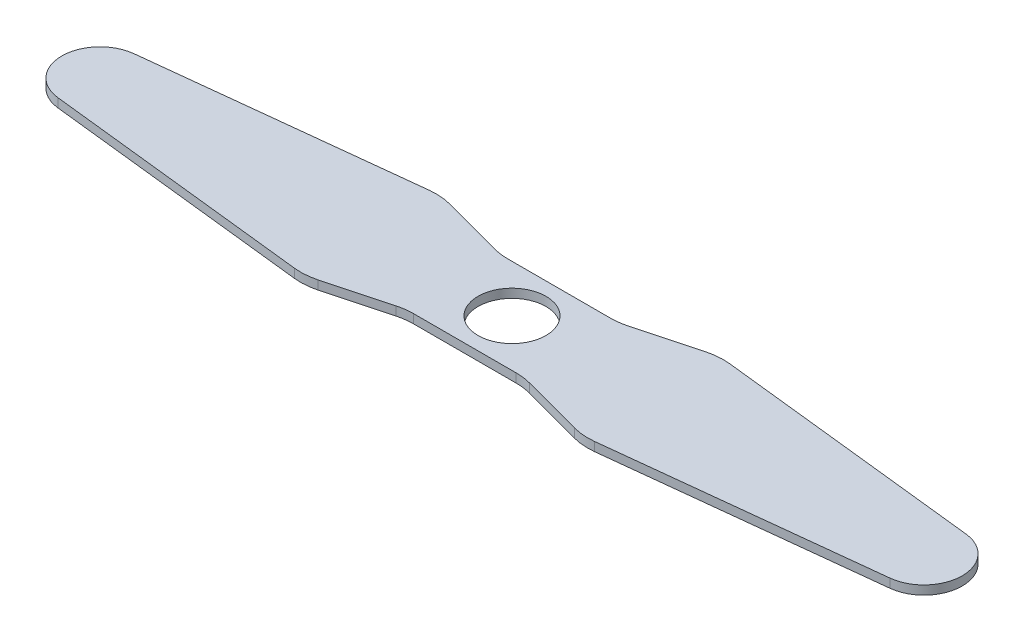
ISO-10303-21;
HEADER;
FILE_DESCRIPTION(('STEP AP214'),'2;1');
FILE_NAME('part.step','',(''),(''),'','','');
FILE_SCHEMA(('AUTOMOTIVE_DESIGN { 1 0 10303 214 1 1 1 1 }'));
ENDSEC;
DATA;
#1=APPLICATION_CONTEXT('core data for automotive mechanical design processes');
#2=APPLICATION_PROTOCOL_DEFINITION('international standard','automotive_design',2000,#1);
#3=PRODUCT_CONTEXT('',#1,'mechanical');
#4=PRODUCT('Part','Part','',(#3));
#5=PRODUCT_RELATED_PRODUCT_CATEGORY('part','',(#4));
#6=PRODUCT_DEFINITION_FORMATION('','',#4);
#7=PRODUCT_DEFINITION_CONTEXT('part definition',#1,'design');
#8=PRODUCT_DEFINITION('design','',#6,#7);
#9=PRODUCT_DEFINITION_SHAPE('','',#8);
#10=(LENGTH_UNIT() NAMED_UNIT(*) SI_UNIT(.MILLI.,.METRE.));
#11=(NAMED_UNIT(*) PLANE_ANGLE_UNIT() SI_UNIT($,.RADIAN.));
#12=(NAMED_UNIT(*) SI_UNIT($,.STERADIAN.) SOLID_ANGLE_UNIT());
#13=UNCERTAINTY_MEASURE_WITH_UNIT(LENGTH_MEASURE(1.E-05),#10,'distance_accuracy_value','');
#14=(GEOMETRIC_REPRESENTATION_CONTEXT(3) GLOBAL_UNCERTAINTY_ASSIGNED_CONTEXT((#13)) GLOBAL_UNIT_ASSIGNED_CONTEXT((#10,
#11,#12)) REPRESENTATION_CONTEXT('',''));
#15=CARTESIAN_POINT('',(0.,0.,0.));
#16=DIRECTION('',(0.,0.,1.));
#17=DIRECTION('',(1.,0.,0.));
#18=AXIS2_PLACEMENT_3D('',#15,#16,#17);
#19=CARTESIAN_POINT('',(0.,0.9525,-15.875));
#20=DIRECTION('',(0.,1.,0.));
#21=DIRECTION('',(0.,0.,1.));
#22=AXIS2_PLACEMENT_3D('',#19,#20,#21);
#23=PLANE('',#22);
#24=DIRECTION('',(1.,0.,0.));
#25=VECTOR('',#24,1.);
#26=CARTESIAN_POINT('',(0.,0.9525,-10.16));
#27=LINE('',#26,#25);
#28=CARTESIAN_POINT('',(-0.868013280640019,0.9525,-10.16));
#29=VERTEX_POINT('',#28);
#30=CARTESIAN_POINT('',(21.18801328064,0.9525,-10.16));
#31=VERTEX_POINT('',#30);
#32=EDGE_CURVE('E361',#29,#31,#27,.T.);
#33=ORIENTED_EDGE('',*,*,#32,.F.);
#34=CARTESIAN_POINT('',(-0.868013280640064,0.9525,-22.86));
#35=DIRECTION('',(0.,-1.,0.));
#36=DIRECTION('',(0.,0.,1.));
#37=AXIS2_PLACEMENT_3D('',#34,#35,#36);
#38=CIRCLE('',#37,12.7);
#39=CARTESIAN_POINT('',(-4.15501515344213,0.9525,-10.5927420061289));
#40=VERTEX_POINT('',#39);
#41=EDGE_CURVE('E252',#40,#29,#38,.F.);
#42=ORIENTED_EDGE('',*,*,#41,.F.);
#43=DIRECTION('',(-0.965925826289068,0.,-0.258819045102522));
#44=VECTOR('',#43,1.);
#45=CARTESIAN_POINT('',(21.3286703652561,0.9525,-3.76440905122493));
#46=LINE('',#45,#44);
#47=CARTESIAN_POINT('',(-17.4067971096181,0.9525,-14.1435462795596));
#48=VERTEX_POINT('',#47);
#49=EDGE_CURVE('E256',#40,#48,#46,.T.);
#50=ORIENTED_EDGE('',*,*,#49,.T.);
#51=CARTESIAN_POINT('',(-20.6937989824202,0.9525,-1.8762882856884));
#52=DIRECTION('',(0.,-1.,0.));
#53=DIRECTION('',(0.,0.,1.));
#54=AXIS2_PLACEMENT_3D('',#51,#52,#53);
#55=CIRCLE('',#54,12.7);
#56=CARTESIAN_POINT('',(-22.0884726731469,0.9525,-14.4994766823018));
#57=VERTEX_POINT('',#56);
#58=EDGE_CURVE('E235',#57,#48,#55,.T.);
#59=ORIENTED_EDGE('',*,*,#58,.F.);
#60=DIRECTION('',(-0.993951842253023,0.,0.109816826041469));
#61=VECTOR('',#60,1.);
#62=CARTESIAN_POINT('',(18.2259089373247,0.9525,-18.9536134363031));
#63=LINE('',#62,#61);
#64=CARTESIAN_POINT('',(-79.2882070496085,0.9525,-8.17976076387293));
#65=VERTEX_POINT('',#64);
#66=EDGE_CURVE('E247',#57,#65,#63,.T.);
#67=ORIENTED_EDGE('',*,*,#66,.T.);
#68=CARTESIAN_POINT('',(-78.3844657145847,0.9525,0.));
#69=DIRECTION('',(0.,-1.,0.));
#70=DIRECTION('',(0.,0.,1.));
#71=AXIS2_PLACEMENT_3D('',#68,#69,#70);
#72=CIRCLE('',#71,8.22953428541527);
#73=CARTESIAN_POINT('',(-79.2882070496085,0.9525,8.17976076387291));
#74=VERTEX_POINT('',#73);
#75=EDGE_CURVE('E251',#65,#74,#72,.F.);
#76=ORIENTED_EDGE('',*,*,#75,.T.);
#77=DIRECTION('',(-0.993951842253023,0.,-0.109816826041469));
#78=VECTOR('',#77,1.);
#79=CARTESIAN_POINT('',(18.2259089373247,0.9525,18.9536134363031));
#80=LINE('',#79,#78);
#81=CARTESIAN_POINT('',(-22.0884726731469,0.9525,14.4994766823018));
#82=VERTEX_POINT('',#81);
#83=EDGE_CURVE('E220',#82,#74,#80,.T.);
#84=ORIENTED_EDGE('',*,*,#83,.F.);
#85=CARTESIAN_POINT('',(-20.6937989824202,0.9525,1.87628828568839));
#86=DIRECTION('',(0.,-1.,0.));
#87=DIRECTION('',(0.,0.,1.));
#88=AXIS2_PLACEMENT_3D('',#85,#86,#87);
#89=CIRCLE('',#88,12.7);
#90=CARTESIAN_POINT('',(-17.4067971096181,0.9525,14.1435462795595));
#91=VERTEX_POINT('',#90);
#92=EDGE_CURVE('E224',#91,#82,#89,.T.);
#93=ORIENTED_EDGE('',*,*,#92,.F.);
#94=DIRECTION('',(-0.965925826289068,0.,0.258819045102521));
#95=VECTOR('',#94,1.);
#96=CARTESIAN_POINT('',(21.3286703652561,0.9525,3.76440905122493));
#97=LINE('',#96,#95);
#98=CARTESIAN_POINT('',(-4.15501515344214,0.9525,10.5927420061288));
#99=VERTEX_POINT('',#98);
#100=EDGE_CURVE('E214',#99,#91,#97,.T.);
#101=ORIENTED_EDGE('',*,*,#100,.F.);
#102=CARTESIAN_POINT('',(-0.868013280640071,0.9525,22.86));
#103=DIRECTION('',(0.,-1.,0.));
#104=DIRECTION('',(0.,0.,1.));
#105=AXIS2_PLACEMENT_3D('',#102,#103,#104);
#106=CIRCLE('',#105,12.7);
#107=CARTESIAN_POINT('',(-0.868013280640022,0.9525,10.16));
#108=VERTEX_POINT('',#107);
#109=EDGE_CURVE('E208',#108,#99,#106,.F.);
#110=ORIENTED_EDGE('',*,*,#109,.F.);
#111=DIRECTION('',(1.,0.,0.));
#112=VECTOR('',#111,1.);
#113=CARTESIAN_POINT('',(0.,0.9525,10.16));
#114=LINE('',#113,#112);
#115=CARTESIAN_POINT('',(21.18801328064,0.9525,10.16));
#116=VERTEX_POINT('',#115);
#117=EDGE_CURVE('E190',#108,#116,#114,.T.);
#118=ORIENTED_EDGE('',*,*,#117,.T.);
#119=CARTESIAN_POINT('',(21.1880132806401,0.9525,22.86));
#120=DIRECTION('',(0.,1.,0.));
#121=DIRECTION('',(0.,0.,1.));
#122=AXIS2_PLACEMENT_3D('',#119,#120,#121);
#123=CIRCLE('',#122,12.7);
#124=CARTESIAN_POINT('',(24.4750151534421,0.9525,10.5927420061288));
#125=VERTEX_POINT('',#124);
#126=EDGE_CURVE('E203',#116,#125,#123,.F.);
#127=ORIENTED_EDGE('',*,*,#126,.T.);
#128=DIRECTION('',(0.965925826289068,0.,0.258819045102521));
#129=VECTOR('',#128,1.);
#130=CARTESIAN_POINT('',(-1.00867036525613,0.9525,3.76440905122493));
#131=LINE('',#130,#129);
#132=CARTESIAN_POINT('',(37.7267971096181,0.9525,14.1435462795595));
#133=VERTEX_POINT('',#132);
#134=EDGE_CURVE('E334',#125,#133,#131,.T.);
#135=ORIENTED_EDGE('',*,*,#134,.T.);
#136=CARTESIAN_POINT('',(41.0137989824202,0.9525,1.87628828568839));
#137=DIRECTION('',(0.,1.,0.));
#138=DIRECTION('',(0.,0.,1.));
#139=AXIS2_PLACEMENT_3D('',#136,#137,#138);
#140=CIRCLE('',#139,12.7);
#141=CARTESIAN_POINT('',(42.4084726731469,0.9525,14.4994766823018));
#142=VERTEX_POINT('',#141);
#143=EDGE_CURVE('E330',#133,#142,#140,.T.);
#144=ORIENTED_EDGE('',*,*,#143,.T.);
#145=DIRECTION('',(0.993951842253023,0.,-0.109816826041469));
#146=VECTOR('',#145,1.);
#147=CARTESIAN_POINT('',(2.09409106267535,0.9525,18.9536134363031));
#148=LINE('',#147,#146);
#149=CARTESIAN_POINT('',(99.6082070496085,0.9525,8.17976076387291));
#150=VERTEX_POINT('',#149);
#151=EDGE_CURVE('E202',#142,#150,#148,.T.);
#152=ORIENTED_EDGE('',*,*,#151,.T.);
#153=CARTESIAN_POINT('',(98.7044657145847,0.9525,0.));
#154=DIRECTION('',(0.,1.,0.));
#155=DIRECTION('',(0.,0.,1.));
#156=AXIS2_PLACEMENT_3D('',#153,#154,#155);
#157=CIRCLE('',#156,8.22953428541527);
#158=CARTESIAN_POINT('',(99.6082070496085,0.9525,-8.17976076387293));
#159=VERTEX_POINT('',#158);
#160=EDGE_CURVE('E360',#159,#150,#157,.F.);
#161=ORIENTED_EDGE('',*,*,#160,.F.);
#162=DIRECTION('',(0.993951842253023,0.,0.109816826041469));
#163=VECTOR('',#162,1.);
#164=CARTESIAN_POINT('',(2.09409106267534,0.9525,-18.9536134363031));
#165=LINE('',#164,#163);
#166=CARTESIAN_POINT('',(42.4084726731469,0.9525,-14.4994766823018));
#167=VERTEX_POINT('',#166);
#168=EDGE_CURVE('E357',#167,#159,#165,.T.);
#169=ORIENTED_EDGE('',*,*,#168,.F.);
#170=CARTESIAN_POINT('',(41.0137989824202,0.9525,-1.8762882856884));
#171=DIRECTION('',(0.,1.,0.));
#172=DIRECTION('',(0.,0.,1.));
#173=AXIS2_PLACEMENT_3D('',#170,#171,#172);
#174=CIRCLE('',#173,12.7);
#175=CARTESIAN_POINT('',(37.7267971096181,0.9525,-14.1435462795596));
#176=VERTEX_POINT('',#175);
#177=EDGE_CURVE('E341',#167,#176,#174,.T.);
#178=ORIENTED_EDGE('',*,*,#177,.T.);
#179=DIRECTION('',(0.965925826289068,0.,-0.258819045102522));
#180=VECTOR('',#179,1.);
#181=CARTESIAN_POINT('',(-1.00867036525613,0.9525,-3.76440905122493));
#182=LINE('',#181,#180);
#183=CARTESIAN_POINT('',(24.4750151534421,0.9525,-10.5927420061289));
#184=VERTEX_POINT('',#183);
#185=EDGE_CURVE('E369',#184,#176,#182,.T.);
#186=ORIENTED_EDGE('',*,*,#185,.F.);
#187=CARTESIAN_POINT('',(21.1880132806401,0.9525,-22.86));
#188=DIRECTION('',(0.,1.,0.));
#189=DIRECTION('',(0.,0.,1.));
#190=AXIS2_PLACEMENT_3D('',#187,#188,#189);
#191=CIRCLE('',#190,12.7);
#192=EDGE_CURVE('E365',#184,#31,#191,.F.);
#193=ORIENTED_EDGE('',*,*,#192,.T.);
#194=EDGE_LOOP('',(#33,#42,#50,#59,#67,#76,#84,#93,#101,#110,#118,#127,#135,#144,#152,#161,#169,
#178,#186,#193));
#195=FACE_BOUND('',#194,.T.);
#196=CARTESIAN_POINT('',(10.16,0.9525,0.));
#197=DIRECTION('',(0.,1.,0.));
#198=DIRECTION('',(0.,0.,1.));
#199=AXIS2_PLACEMENT_3D('',#196,#197,#198);
#200=CIRCLE('',#199,7.3025);
#201=CARTESIAN_POINT('',(10.16,0.9525,7.3025));
#202=VERTEX_POINT('',#201);
#203=EDGE_CURVE('E317',#202,#202,#200,.T.);
#204=ORIENTED_EDGE('',*,*,#203,.F.);
#205=EDGE_LOOP('',(#204));
#206=FACE_BOUND('',#205,.T.);
#207=ADVANCED_FACE('F51',(#195,#206),#23,.T.);
#208=CARTESIAN_POINT('',(0.,-0.9525,15.875));
#209=DIRECTION('',(0.,-1.,0.));
#210=DIRECTION('',(0.,0.,-1.));
#211=AXIS2_PLACEMENT_3D('',#208,#209,#210);
#212=PLANE('',#211);
#213=DIRECTION('',(-1.,0.,0.));
#214=VECTOR('',#213,1.);
#215=CARTESIAN_POINT('',(0.,-0.9525,10.16));
#216=LINE('',#215,#214);
#217=CARTESIAN_POINT('',(21.18801328064,-0.9525,10.16));
#218=VERTEX_POINT('',#217);
#219=CARTESIAN_POINT('',(-0.868013280640022,-0.9525,10.16));
#220=VERTEX_POINT('',#219);
#221=EDGE_CURVE('E411',#218,#220,#216,.T.);
#222=ORIENTED_EDGE('',*,*,#221,.T.);
#223=CARTESIAN_POINT('',(-0.868013280640071,-0.9525,22.86));
#224=DIRECTION('',(0.,1.,0.));
#225=DIRECTION('',(-1.,0.,0.));
#226=AXIS2_PLACEMENT_3D('',#223,#224,#225);
#227=CIRCLE('',#226,12.7);
#228=CARTESIAN_POINT('',(-4.15501515344214,-0.9525,10.5927420061288));
#229=VERTEX_POINT('',#228);
#230=EDGE_CURVE('E211',#229,#220,#227,.F.);
#231=ORIENTED_EDGE('',*,*,#230,.F.);
#232=DIRECTION('',(0.965925826289068,0.,-0.258819045102521));
#233=VECTOR('',#232,1.);
#234=CARTESIAN_POINT('',(17.3599203652561,-0.9525,4.82783240868596));
#235=LINE('',#234,#233);
#236=CARTESIAN_POINT('',(-17.4067971096181,-0.9525,14.1435462795595));
#237=VERTEX_POINT('',#236);
#238=EDGE_CURVE('E305',#237,#229,#235,.T.);
#239=ORIENTED_EDGE('',*,*,#238,.F.);
#240=CARTESIAN_POINT('',(-20.6937989824202,-0.9525,1.87628828568839));
#241=DIRECTION('',(0.,1.,0.));
#242=DIRECTION('',(-1.,0.,0.));
#243=AXIS2_PLACEMENT_3D('',#240,#241,#242);
#244=CIRCLE('',#243,12.7);
#245=CARTESIAN_POINT('',(-22.0884726731469,-0.9525,14.4994766823018));
#246=VERTEX_POINT('',#245);
#247=EDGE_CURVE('E309',#246,#237,#244,.T.);
#248=ORIENTED_EDGE('',*,*,#247,.F.);
#249=DIRECTION('',(0.993951842253023,0.,0.109816826041469));
#250=VECTOR('',#249,1.);
#251=CARTESIAN_POINT('',(19.9587070426241,-0.9525,19.1450617339021));
#252=LINE('',#251,#250);
#253=CARTESIAN_POINT('',(-79.2882070496085,-0.9525,8.17976076387291));
#254=VERTEX_POINT('',#253);
#255=EDGE_CURVE('E313',#254,#246,#252,.T.);
#256=ORIENTED_EDGE('',*,*,#255,.F.);
#257=CARTESIAN_POINT('',(-78.3844657145847,-0.9525,0.));
#258=DIRECTION('',(0.,1.,0.));
#259=DIRECTION('',(-1.,0.,0.));
#260=AXIS2_PLACEMENT_3D('',#257,#258,#259);
#261=CIRCLE('',#260,8.22953428541527);
#262=CARTESIAN_POINT('',(-79.2882070496085,-0.9525,-8.17976076387293));
#263=VERTEX_POINT('',#262);
#264=EDGE_CURVE('E285',#254,#263,#261,.F.);
#265=ORIENTED_EDGE('',*,*,#264,.T.);
#266=DIRECTION('',(0.993951842253023,0.,-0.109816826041469));
#267=VECTOR('',#266,1.);
#268=CARTESIAN_POINT('',(16.4931108320252,-0.9525,-18.7621651387042));
#269=LINE('',#268,#267);
#270=CARTESIAN_POINT('',(-22.0884726731469,-0.9525,-14.4994766823018));
#271=VERTEX_POINT('',#270);
#272=EDGE_CURVE('E264',#263,#271,#269,.T.);
#273=ORIENTED_EDGE('',*,*,#272,.T.);
#274=CARTESIAN_POINT('',(-20.6937989824202,-0.9525,-1.8762882856884));
#275=DIRECTION('',(0.,1.,0.));
#276=DIRECTION('',(-1.,0.,0.));
#277=AXIS2_PLACEMENT_3D('',#274,#275,#276);
#278=CIRCLE('',#277,12.7);
#279=CARTESIAN_POINT('',(-17.4067971096181,-0.9525,-14.1435462795596));
#280=VERTEX_POINT('',#279);
#281=EDGE_CURVE('E289',#280,#271,#278,.T.);
#282=ORIENTED_EDGE('',*,*,#281,.F.);
#283=DIRECTION('',(0.965925826289068,0.,0.258819045102522));
#284=VECTOR('',#283,1.);
#285=CARTESIAN_POINT('',(25.2974203652561,-0.9525,-2.70098569376391));
#286=LINE('',#285,#284);
#287=CARTESIAN_POINT('',(-4.15501515344213,-0.9525,-10.5927420061289));
#288=VERTEX_POINT('',#287);
#289=EDGE_CURVE('E295',#280,#288,#286,.T.);
#290=ORIENTED_EDGE('',*,*,#289,.T.);
#291=CARTESIAN_POINT('',(-0.868013280640064,-0.9525,-22.86));
#292=DIRECTION('',(0.,1.,0.));
#293=DIRECTION('',(-1.,0.,0.));
#294=AXIS2_PLACEMENT_3D('',#291,#292,#293);
#295=CIRCLE('',#294,12.7);
#296=CARTESIAN_POINT('',(-0.868013280640019,-0.9525,-10.16));
#297=VERTEX_POINT('',#296);
#298=EDGE_CURVE('E299',#297,#288,#295,.F.);
#299=ORIENTED_EDGE('',*,*,#298,.F.);
#300=DIRECTION('',(-1.,0.,0.));
#301=VECTOR('',#300,1.);
#302=CARTESIAN_POINT('',(0.,-0.9525,-10.16));
#303=LINE('',#302,#301);
#304=CARTESIAN_POINT('',(21.18801328064,-0.9525,-10.16));
#305=VERTEX_POINT('',#304);
#306=EDGE_CURVE('E408',#305,#297,#303,.T.);
#307=ORIENTED_EDGE('',*,*,#306,.F.);
#308=CARTESIAN_POINT('',(21.1880132806401,-0.9525,-22.86));
#309=DIRECTION('',(0.,-1.,0.));
#310=DIRECTION('',(1.,0.,0.));
#311=AXIS2_PLACEMENT_3D('',#308,#309,#310);
#312=CIRCLE('',#311,12.7);
#313=CARTESIAN_POINT('',(24.4750151534421,-0.9525,-10.5927420061289));
#314=VERTEX_POINT('',#313);
#315=EDGE_CURVE('E404',#305,#314,#312,.F.);
#316=ORIENTED_EDGE('',*,*,#315,.T.);
#317=DIRECTION('',(-0.965925826289068,0.,0.258819045102522));
#318=VECTOR('',#317,1.);
#319=CARTESIAN_POINT('',(-4.97742036525615,-0.9525,-2.70098569376391));
#320=LINE('',#319,#318);
#321=CARTESIAN_POINT('',(37.7267971096181,-0.9525,-14.1435462795596));
#322=VERTEX_POINT('',#321);
#323=EDGE_CURVE('E401',#322,#314,#320,.T.);
#324=ORIENTED_EDGE('',*,*,#323,.F.);
#325=CARTESIAN_POINT('',(41.0137989824202,-0.9525,-1.8762882856884));
#326=DIRECTION('',(0.,-1.,0.));
#327=DIRECTION('',(1.,0.,0.));
#328=AXIS2_PLACEMENT_3D('',#325,#326,#327);
#329=CIRCLE('',#328,12.7);
#330=CARTESIAN_POINT('',(42.4084726731469,-0.9525,-14.4994766823018));
#331=VERTEX_POINT('',#330);
#332=EDGE_CURVE('E75',#322,#331,#329,.T.);
#333=ORIENTED_EDGE('',*,*,#332,.T.);
#334=DIRECTION('',(-0.993951842253023,0.,-0.109816826041469));
#335=VECTOR('',#334,1.);
#336=CARTESIAN_POINT('',(3.82688916797482,-0.9525,-18.7621651387042));
#337=LINE('',#336,#335);
#338=CARTESIAN_POINT('',(99.6082070496085,-0.9525,-8.17976076387293));
#339=VERTEX_POINT('',#338);
#340=EDGE_CURVE('E377',#339,#331,#337,.T.);
#341=ORIENTED_EDGE('',*,*,#340,.F.);
#342=CARTESIAN_POINT('',(98.7044657145847,-0.9525,0.));
#343=DIRECTION('',(0.,-1.,0.));
#344=DIRECTION('',(1.,0.,0.));
#345=AXIS2_PLACEMENT_3D('',#342,#343,#344);
#346=CIRCLE('',#345,8.22953428541527);
#347=CARTESIAN_POINT('',(99.6082070496085,-0.9525,8.17976076387291));
#348=VERTEX_POINT('',#347);
#349=EDGE_CURVE('E394',#348,#339,#346,.F.);
#350=ORIENTED_EDGE('',*,*,#349,.F.);
#351=DIRECTION('',(-0.993951842253023,0.,0.109816826041469));
#352=VECTOR('',#351,1.);
#353=CARTESIAN_POINT('',(0.361292957375868,-0.9525,19.1450617339021));
#354=LINE('',#353,#352);
#355=CARTESIAN_POINT('',(42.4084726731469,-0.9525,14.4994766823018));
#356=VERTEX_POINT('',#355);
#357=EDGE_CURVE('E12',#348,#356,#354,.T.);
#358=ORIENTED_EDGE('',*,*,#357,.T.);
#359=CARTESIAN_POINT('',(41.0137989824202,-0.9525,1.87628828568839));
#360=DIRECTION('',(0.,-1.,0.));
#361=DIRECTION('',(1.,0.,0.));
#362=AXIS2_PLACEMENT_3D('',#359,#360,#361);
#363=CIRCLE('',#362,12.7);
#364=CARTESIAN_POINT('',(37.7267971096181,-0.9525,14.1435462795595));
#365=VERTEX_POINT('',#364);
#366=EDGE_CURVE('E60',#356,#365,#363,.T.);
#367=ORIENTED_EDGE('',*,*,#366,.T.);
#368=DIRECTION('',(-0.965925826289068,0.,-0.258819045102521));
#369=VECTOR('',#368,1.);
#370=CARTESIAN_POINT('',(2.96007963474388,-0.9525,4.82783240868596));
#371=LINE('',#370,#369);
#372=CARTESIAN_POINT('',(24.4750151534421,-0.9525,10.5927420061288));
#373=VERTEX_POINT('',#372);
#374=EDGE_CURVE('E418',#365,#373,#371,.T.);
#375=ORIENTED_EDGE('',*,*,#374,.T.);
#376=CARTESIAN_POINT('',(21.1880132806401,-0.9525,22.86));
#377=DIRECTION('',(0.,-1.,0.));
#378=DIRECTION('',(1.,0.,0.));
#379=AXIS2_PLACEMENT_3D('',#376,#377,#378);
#380=CIRCLE('',#379,12.7);
#381=EDGE_CURVE('E414',#373,#218,#380,.F.);
#382=ORIENTED_EDGE('',*,*,#381,.T.);
#383=EDGE_LOOP('',(#222,#231,#239,#248,#256,#265,#273,#282,#290,#299,#307,#316,#324,#333,#341,
#350,#358,#367,#375,#382));
#384=FACE_BOUND('',#383,.T.);
#385=CARTESIAN_POINT('',(10.16,-0.9525,0.));
#386=DIRECTION('',(0.,1.,0.));
#387=DIRECTION('',(0.,0.,1.));
#388=AXIS2_PLACEMENT_3D('',#385,#386,#387);
#389=CIRCLE('',#388,7.3025);
#390=CARTESIAN_POINT('',(10.16,-0.9525,7.3025));
#391=VERTEX_POINT('',#390);
#392=EDGE_CURVE('E318',#391,#391,#389,.T.);
#393=ORIENTED_EDGE('',*,*,#392,.T.);
#394=EDGE_LOOP('',(#393));
#395=FACE_BOUND('',#394,.T.);
#396=ADVANCED_FACE('F53',(#384,#395),#212,.T.);
#397=CARTESIAN_POINT('',(41.0137989824202,-0.9526,-1.8762882856884));
#398=DIRECTION('',(0.,1.,0.));
#399=DIRECTION('',(0.,0.,1.));
#400=AXIS2_PLACEMENT_3D('',#397,#398,#399);
#401=CYLINDRICAL_SURFACE('',#400,12.7);
#402=DIRECTION('',(0.,1.,0.));
#403=VECTOR('',#402,1.);
#404=CARTESIAN_POINT('',(37.7267971096181,-0.9526,-14.1435462795596));
#405=LINE('',#404,#403);
#406=EDGE_CURVE('E374',#322,#176,#405,.T.);
#407=ORIENTED_EDGE('',*,*,#406,.T.);
#408=ORIENTED_EDGE('',*,*,#177,.F.);
#409=DIRECTION('',(0.,1.,0.));
#410=VECTOR('',#409,1.);
#411=CARTESIAN_POINT('',(42.4084726731469,-0.9526,-14.4994766823018));
#412=LINE('',#411,#410);
#413=EDGE_CURVE('E373',#331,#167,#412,.T.);
#414=ORIENTED_EDGE('',*,*,#413,.F.);
#415=ORIENTED_EDGE('',*,*,#332,.F.);
#416=EDGE_LOOP('',(#407,#408,#414,#415));
#417=FACE_BOUND('',#416,.T.);
#418=ADVANCED_FACE('F488',(#417),#401,.T.);
#419=CARTESIAN_POINT('',(-1.00867036525613,-0.9526,-3.76440905122493));
#420=DIRECTION('',(0.258819045102522,0.,0.965925826289068));
#421=DIRECTION('',(0.965925826289068,0.,-0.258819045102522));
#422=AXIS2_PLACEMENT_3D('',#419,#420,#421);
#423=PLANE('',#422);
#424=ORIENTED_EDGE('',*,*,#323,.T.);
#425=DIRECTION('',(0.,1.,0.));
#426=VECTOR('',#425,1.);
#427=CARTESIAN_POINT('',(24.4750151534421,-0.9526,-10.5927420061289));
#428=LINE('',#427,#426);
#429=EDGE_CURVE('E378',#314,#184,#428,.T.);
#430=ORIENTED_EDGE('',*,*,#429,.T.);
#431=ORIENTED_EDGE('',*,*,#185,.T.);
#432=ORIENTED_EDGE('',*,*,#406,.F.);
#433=EDGE_LOOP('',(#424,#430,#431,#432));
#434=FACE_BOUND('',#433,.T.);
#435=ADVANCED_FACE('F484',(#434),#423,.F.);
#436=CARTESIAN_POINT('',(21.1880132806401,-0.9526,-22.86));
#437=DIRECTION('',(0.,1.,0.));
#438=DIRECTION('',(0.,0.,1.));
#439=AXIS2_PLACEMENT_3D('',#436,#437,#438);
#440=CYLINDRICAL_SURFACE('',#439,12.7);
#441=DIRECTION('',(0.,1.,0.));
#442=VECTOR('',#441,1.);
#443=CARTESIAN_POINT('',(21.18801328064,-0.9526,-10.16));
#444=LINE('',#443,#442);
#445=EDGE_CURVE('E381',#305,#31,#444,.T.);
#446=ORIENTED_EDGE('',*,*,#445,.T.);
#447=ORIENTED_EDGE('',*,*,#192,.F.);
#448=ORIENTED_EDGE('',*,*,#429,.F.);
#449=ORIENTED_EDGE('',*,*,#315,.F.);
#450=EDGE_LOOP('',(#446,#447,#448,#449));
#451=FACE_BOUND('',#450,.T.);
#452=ADVANCED_FACE('F480',(#451),#440,.F.);
#453=CARTESIAN_POINT('',(0.,-0.9526,-10.16));
#454=DIRECTION('',(0.,0.,1.));
#455=DIRECTION('',(1.,0.,0.));
#456=AXIS2_PLACEMENT_3D('',#453,#454,#455);
#457=PLANE('',#456);
#458=ORIENTED_EDGE('',*,*,#306,.T.);
#459=DIRECTION('',(0.,1.,0.));
#460=VECTOR('',#459,1.);
#461=CARTESIAN_POINT('',(-0.868013280640019,-0.9526,-10.16));
#462=LINE('',#461,#460);
#463=EDGE_CURVE('E268',#297,#29,#462,.T.);
#464=ORIENTED_EDGE('',*,*,#463,.T.);
#465=ORIENTED_EDGE('',*,*,#32,.T.);
#466=ORIENTED_EDGE('',*,*,#445,.F.);
#467=EDGE_LOOP('',(#458,#464,#465,#466));
#468=FACE_BOUND('',#467,.T.);
#469=ADVANCED_FACE('F477',(#468),#457,.F.);
#470=CARTESIAN_POINT('',(98.7044657145847,-0.9526,0.));
#471=DIRECTION('',(0.,1.,0.));
#472=DIRECTION('',(0.,0.,1.));
#473=AXIS2_PLACEMENT_3D('',#470,#471,#472);
#474=CYLINDRICAL_SURFACE('',#473,8.22953428541527);
#475=ORIENTED_EDGE('',*,*,#349,.T.);
#476=DIRECTION('',(0.,1.,0.));
#477=VECTOR('',#476,1.);
#478=CARTESIAN_POINT('',(99.6082070496085,-0.9526,-8.17976076387293));
#479=LINE('',#478,#477);
#480=EDGE_CURVE('E67',#339,#159,#479,.T.);
#481=ORIENTED_EDGE('',*,*,#480,.T.);
#482=ORIENTED_EDGE('',*,*,#160,.T.);
#483=DIRECTION('',(0.,1.,0.));
#484=VECTOR('',#483,1.);
#485=CARTESIAN_POINT('',(99.6082070496085,-0.9526,8.17976076387291));
#486=LINE('',#485,#484);
#487=EDGE_CURVE('E348',#348,#150,#486,.T.);
#488=ORIENTED_EDGE('',*,*,#487,.F.);
#489=EDGE_LOOP('',(#475,#481,#482,#488));
#490=FACE_BOUND('',#489,.T.);
#491=ADVANCED_FACE('F491',(#490),#474,.T.);
#492=CARTESIAN_POINT('',(2.09409106267534,-0.9526,-18.9536134363031));
#493=DIRECTION('',(-0.109816826041469,0.,0.993951842253023));
#494=DIRECTION('',(0.993951842253023,0.,0.109816826041469));
#495=AXIS2_PLACEMENT_3D('',#492,#493,#494);
#496=PLANE('',#495);
#497=ORIENTED_EDGE('',*,*,#340,.T.);
#498=ORIENTED_EDGE('',*,*,#413,.T.);
#499=ORIENTED_EDGE('',*,*,#168,.T.);
#500=ORIENTED_EDGE('',*,*,#480,.F.);
#501=EDGE_LOOP('',(#497,#498,#499,#500));
#502=FACE_BOUND('',#501,.T.);
#503=ADVANCED_FACE('F486',(#502),#496,.F.);
#504=CARTESIAN_POINT('',(21.1880132806401,-0.9526,22.86));
#505=DIRECTION('',(0.,1.,0.));
#506=DIRECTION('',(0.,0.,1.));
#507=AXIS2_PLACEMENT_3D('',#504,#505,#506);
#508=CYLINDRICAL_SURFACE('',#507,12.7);
#509=DIRECTION('',(0.,1.,0.));
#510=VECTOR('',#509,1.);
#511=CARTESIAN_POINT('',(24.4750151534421,-0.9526,10.5927420061288));
#512=LINE('',#511,#510);
#513=EDGE_CURVE('E338',#373,#125,#512,.T.);
#514=ORIENTED_EDGE('',*,*,#513,.T.);
#515=ORIENTED_EDGE('',*,*,#126,.F.);
#516=DIRECTION('',(0.,1.,0.));
#517=VECTOR('',#516,1.);
#518=CARTESIAN_POINT('',(21.18801328064,-0.9526,10.16));
#519=LINE('',#518,#517);
#520=EDGE_CURVE('E196',#218,#116,#519,.T.);
#521=ORIENTED_EDGE('',*,*,#520,.F.);
#522=ORIENTED_EDGE('',*,*,#381,.F.);
#523=EDGE_LOOP('',(#514,#515,#521,#522));
#524=FACE_BOUND('',#523,.T.);
#525=ADVANCED_FACE('F441',(#524),#508,.F.);
#526=CARTESIAN_POINT('',(-1.00867036525613,-0.9526,3.76440905122493));
#527=DIRECTION('',(-0.258819045102521,0.,0.965925826289068));
#528=DIRECTION('',(0.965925826289068,0.,0.258819045102521));
#529=AXIS2_PLACEMENT_3D('',#526,#527,#528);
#530=PLANE('',#529);
#531=DIRECTION('',(0.,1.,0.));
#532=VECTOR('',#531,1.);
#533=CARTESIAN_POINT('',(37.7267971096181,-0.9526,14.1435462795595));
#534=LINE('',#533,#532);
#535=EDGE_CURVE('E342',#365,#133,#534,.T.);
#536=ORIENTED_EDGE('',*,*,#535,.T.);
#537=ORIENTED_EDGE('',*,*,#134,.F.);
#538=ORIENTED_EDGE('',*,*,#513,.F.);
#539=ORIENTED_EDGE('',*,*,#374,.F.);
#540=EDGE_LOOP('',(#536,#537,#538,#539));
#541=FACE_BOUND('',#540,.T.);
#542=ADVANCED_FACE('F439',(#541),#530,.T.);
#543=CARTESIAN_POINT('',(41.0137989824202,-0.9526,1.87628828568839));
#544=DIRECTION('',(0.,1.,0.));
#545=DIRECTION('',(0.,0.,1.));
#546=AXIS2_PLACEMENT_3D('',#543,#544,#545);
#547=CYLINDRICAL_SURFACE('',#546,12.7);
#548=DIRECTION('',(0.,1.,0.));
#549=VECTOR('',#548,1.);
#550=CARTESIAN_POINT('',(42.4084726731469,-0.9526,14.4994766823018));
#551=LINE('',#550,#549);
#552=EDGE_CURVE('E345',#356,#142,#551,.T.);
#553=ORIENTED_EDGE('',*,*,#552,.T.);
#554=ORIENTED_EDGE('',*,*,#143,.F.);
#555=ORIENTED_EDGE('',*,*,#535,.F.);
#556=ORIENTED_EDGE('',*,*,#366,.F.);
#557=EDGE_LOOP('',(#553,#554,#555,#556));
#558=FACE_BOUND('',#557,.T.);
#559=ADVANCED_FACE('F429',(#558),#547,.T.);
#560=CARTESIAN_POINT('',(2.09409106267535,-0.9526,18.9536134363031));
#561=DIRECTION('',(0.109816826041469,0.,0.993951842253023));
#562=DIRECTION('',(0.993951842253023,0.,-0.109816826041469));
#563=AXIS2_PLACEMENT_3D('',#560,#561,#562);
#564=PLANE('',#563);
#565=ORIENTED_EDGE('',*,*,#487,.T.);
#566=ORIENTED_EDGE('',*,*,#151,.F.);
#567=ORIENTED_EDGE('',*,*,#552,.F.);
#568=ORIENTED_EDGE('',*,*,#357,.F.);
#569=EDGE_LOOP('',(#565,#566,#567,#568));
#570=FACE_BOUND('',#569,.T.);
#571=ADVANCED_FACE('F433',(#570),#564,.T.);
#572=CARTESIAN_POINT('',(0.,-0.9526,10.16));
#573=DIRECTION('',(0.,0.,1.));
#574=DIRECTION('',(1.,0.,0.));
#575=AXIS2_PLACEMENT_3D('',#572,#573,#574);
#576=PLANE('',#575);
#577=ORIENTED_EDGE('',*,*,#520,.T.);
#578=ORIENTED_EDGE('',*,*,#117,.F.);
#579=DIRECTION('',(0.,1.,0.));
#580=VECTOR('',#579,1.);
#581=CARTESIAN_POINT('',(-0.868013280640022,-0.9526,10.16));
#582=LINE('',#581,#580);
#583=EDGE_CURVE('E193',#220,#108,#582,.T.);
#584=ORIENTED_EDGE('',*,*,#583,.F.);
#585=ORIENTED_EDGE('',*,*,#221,.F.);
#586=EDGE_LOOP('',(#577,#578,#584,#585));
#587=FACE_BOUND('',#586,.T.);
#588=ADVANCED_FACE('F192',(#587),#576,.T.);
#589=CARTESIAN_POINT('',(10.16,-0.9525,0.));
#590=DIRECTION('',(0.,1.,0.));
#591=DIRECTION('',(0.,0.,1.));
#592=AXIS2_PLACEMENT_3D('',#589,#590,#591);
#593=CYLINDRICAL_SURFACE('',#592,7.3025);
#594=ORIENTED_EDGE('',*,*,#392,.F.);
#595=EDGE_LOOP('',(#594));
#596=FACE_BOUND('',#595,.T.);
#597=ORIENTED_EDGE('',*,*,#203,.T.);
#598=EDGE_LOOP('',(#597));
#599=FACE_BOUND('',#598,.T.);
#600=ADVANCED_FACE('F519',(#596,#599),#593,.F.);
#601=CARTESIAN_POINT('',(-20.6937989824202,-0.9526,-1.8762882856884));
#602=DIRECTION('',(0.,1.,0.));
#603=DIRECTION('',(0.,0.,1.));
#604=AXIS2_PLACEMENT_3D('',#601,#602,#603);
#605=CYLINDRICAL_SURFACE('',#604,12.7);
#606=DIRECTION('',(0.,1.,0.));
#607=VECTOR('',#606,1.);
#608=CARTESIAN_POINT('',(-17.4067971096181,-0.9526,-14.1435462795596));
#609=LINE('',#608,#607);
#610=EDGE_CURVE('E261',#280,#48,#609,.T.);
#611=ORIENTED_EDGE('',*,*,#610,.F.);
#612=ORIENTED_EDGE('',*,*,#281,.T.);
#613=DIRECTION('',(0.,1.,0.));
#614=VECTOR('',#613,1.);
#615=CARTESIAN_POINT('',(-22.0884726731469,-0.9526,-14.4994766823018));
#616=LINE('',#615,#614);
#617=EDGE_CURVE('E260',#271,#57,#616,.T.);
#618=ORIENTED_EDGE('',*,*,#617,.T.);
#619=ORIENTED_EDGE('',*,*,#58,.T.);
#620=EDGE_LOOP('',(#611,#612,#618,#619));
#621=FACE_BOUND('',#620,.T.);
#622=ADVANCED_FACE('F464',(#621),#605,.T.);
#623=CARTESIAN_POINT('',(21.3286703652561,-0.9526,-3.76440905122493));
#624=DIRECTION('',(-0.258819045102522,0.,0.965925826289068));
#625=DIRECTION('',(-0.965925826289068,0.,-0.258819045102522));
#626=AXIS2_PLACEMENT_3D('',#623,#624,#625);
#627=PLANE('',#626);
#628=ORIENTED_EDGE('',*,*,#289,.F.);
#629=ORIENTED_EDGE('',*,*,#610,.T.);
#630=ORIENTED_EDGE('',*,*,#49,.F.);
#631=DIRECTION('',(0.,1.,0.));
#632=VECTOR('',#631,1.);
#633=CARTESIAN_POINT('',(-4.15501515344213,-0.9526,-10.5927420061289));
#634=LINE('',#633,#632);
#635=EDGE_CURVE('E265',#288,#40,#634,.T.);
#636=ORIENTED_EDGE('',*,*,#635,.F.);
#637=EDGE_LOOP('',(#628,#629,#630,#636));
#638=FACE_BOUND('',#637,.T.);
#639=ADVANCED_FACE('F468',(#638),#627,.F.);
#640=CARTESIAN_POINT('',(-0.868013280640064,-0.9526,-22.86));
#641=DIRECTION('',(0.,1.,0.));
#642=DIRECTION('',(0.,0.,1.));
#643=AXIS2_PLACEMENT_3D('',#640,#641,#642);
#644=CYLINDRICAL_SURFACE('',#643,12.7);
#645=ORIENTED_EDGE('',*,*,#463,.F.);
#646=ORIENTED_EDGE('',*,*,#298,.T.);
#647=ORIENTED_EDGE('',*,*,#635,.T.);
#648=ORIENTED_EDGE('',*,*,#41,.T.);
#649=EDGE_LOOP('',(#645,#646,#647,#648));
#650=FACE_BOUND('',#649,.T.);
#651=ADVANCED_FACE('F472',(#650),#644,.F.);
#652=CARTESIAN_POINT('',(-78.3844657145847,-0.9526,0.));
#653=DIRECTION('',(0.,1.,0.));
#654=DIRECTION('',(0.,0.,1.));
#655=AXIS2_PLACEMENT_3D('',#652,#653,#654);
#656=CYLINDRICAL_SURFACE('',#655,8.22953428541527);
#657=ORIENTED_EDGE('',*,*,#264,.F.);
#658=DIRECTION('',(0.,1.,0.));
#659=VECTOR('',#658,1.);
#660=CARTESIAN_POINT('',(-79.2882070496085,-0.9526,8.17976076387291));
#661=LINE('',#660,#659);
#662=EDGE_CURVE('E213',#254,#74,#661,.T.);
#663=ORIENTED_EDGE('',*,*,#662,.T.);
#664=ORIENTED_EDGE('',*,*,#75,.F.);
#665=DIRECTION('',(0.,1.,0.));
#666=VECTOR('',#665,1.);
#667=CARTESIAN_POINT('',(-79.2882070496085,-0.9526,-8.17976076387293));
#668=LINE('',#667,#666);
#669=EDGE_CURVE('E272',#263,#65,#668,.T.);
#670=ORIENTED_EDGE('',*,*,#669,.F.);
#671=EDGE_LOOP('',(#657,#663,#664,#670));
#672=FACE_BOUND('',#671,.T.);
#673=ADVANCED_FACE('F454',(#672),#656,.T.);
#674=CARTESIAN_POINT('',(18.2259089373247,-0.9526,-18.9536134363031));
#675=DIRECTION('',(0.109816826041469,0.,0.993951842253023));
#676=DIRECTION('',(-0.993951842253023,0.,0.109816826041469));
#677=AXIS2_PLACEMENT_3D('',#674,#675,#676);
#678=PLANE('',#677);
#679=ORIENTED_EDGE('',*,*,#272,.F.);
#680=ORIENTED_EDGE('',*,*,#669,.T.);
#681=ORIENTED_EDGE('',*,*,#66,.F.);
#682=ORIENTED_EDGE('',*,*,#617,.F.);
#683=EDGE_LOOP('',(#679,#680,#681,#682));
#684=FACE_BOUND('',#683,.T.);
#685=ADVANCED_FACE('F459',(#684),#678,.F.);
#686=CARTESIAN_POINT('',(-0.868013280640071,-0.9526,22.86));
#687=DIRECTION('',(0.,1.,0.));
#688=DIRECTION('',(0.,0.,1.));
#689=AXIS2_PLACEMENT_3D('',#686,#687,#688);
#690=CYLINDRICAL_SURFACE('',#689,12.7);
#691=DIRECTION('',(0.,1.,0.));
#692=VECTOR('',#691,1.);
#693=CARTESIAN_POINT('',(-4.15501515344214,-0.9526,10.5927420061288));
#694=LINE('',#693,#692);
#695=EDGE_CURVE('E232',#229,#99,#694,.T.);
#696=ORIENTED_EDGE('',*,*,#695,.F.);
#697=ORIENTED_EDGE('',*,*,#230,.T.);
#698=ORIENTED_EDGE('',*,*,#583,.T.);
#699=ORIENTED_EDGE('',*,*,#109,.T.);
#700=EDGE_LOOP('',(#696,#697,#698,#699));
#701=FACE_BOUND('',#700,.T.);
#702=ADVANCED_FACE('F207',(#701),#690,.F.);
#703=CARTESIAN_POINT('',(21.3286703652561,-0.9526,3.76440905122493));
#704=DIRECTION('',(0.258819045102521,0.,0.965925826289068));
#705=DIRECTION('',(-0.965925826289068,0.,0.258819045102521));
#706=AXIS2_PLACEMENT_3D('',#703,#704,#705);
#707=PLANE('',#706);
#708=DIRECTION('',(0.,1.,0.));
#709=VECTOR('',#708,1.);
#710=CARTESIAN_POINT('',(-17.4067971096181,-0.9526,14.1435462795595));
#711=LINE('',#710,#709);
#712=EDGE_CURVE('E236',#237,#91,#711,.T.);
#713=ORIENTED_EDGE('',*,*,#712,.F.);
#714=ORIENTED_EDGE('',*,*,#238,.T.);
#715=ORIENTED_EDGE('',*,*,#695,.T.);
#716=ORIENTED_EDGE('',*,*,#100,.T.);
#717=EDGE_LOOP('',(#713,#714,#715,#716));
#718=FACE_BOUND('',#717,.T.);
#719=ADVANCED_FACE('F446',(#718),#707,.T.);
#720=CARTESIAN_POINT('',(-20.6937989824202,-0.9526,1.87628828568839));
#721=DIRECTION('',(0.,1.,0.));
#722=DIRECTION('',(0.,0.,1.));
#723=AXIS2_PLACEMENT_3D('',#720,#721,#722);
#724=CYLINDRICAL_SURFACE('',#723,12.7);
#725=DIRECTION('',(0.,1.,0.));
#726=VECTOR('',#725,1.);
#727=CARTESIAN_POINT('',(-22.0884726731469,-0.9526,14.4994766823018));
#728=LINE('',#727,#726);
#729=EDGE_CURVE('E239',#246,#82,#728,.T.);
#730=ORIENTED_EDGE('',*,*,#729,.F.);
#731=ORIENTED_EDGE('',*,*,#247,.T.);
#732=ORIENTED_EDGE('',*,*,#712,.T.);
#733=ORIENTED_EDGE('',*,*,#92,.T.);
#734=EDGE_LOOP('',(#730,#731,#732,#733));
#735=FACE_BOUND('',#734,.T.);
#736=ADVANCED_FACE('F448',(#735),#724,.T.);
#737=CARTESIAN_POINT('',(18.2259089373247,-0.9526,18.9536134363031));
#738=DIRECTION('',(-0.109816826041469,0.,0.993951842253023));
#739=DIRECTION('',(-0.993951842253023,0.,-0.109816826041469));
#740=AXIS2_PLACEMENT_3D('',#737,#738,#739);
#741=PLANE('',#740);
#742=ORIENTED_EDGE('',*,*,#662,.F.);
#743=ORIENTED_EDGE('',*,*,#255,.T.);
#744=ORIENTED_EDGE('',*,*,#729,.T.);
#745=ORIENTED_EDGE('',*,*,#83,.T.);
#746=EDGE_LOOP('',(#742,#743,#744,#745));
#747=FACE_BOUND('',#746,.T.);
#748=ADVANCED_FACE('F451',(#747),#741,.T.);
#749=CLOSED_SHELL('',(#207,#396,#418,#435,#452,#469,#491,#503,#525,#542,#559,#571,#588,#600,
#622,#639,#651,#673,#685,#702,#719,#736,#748));
#750=MANIFOLD_SOLID_BREP('B2',#749);
#751=ADVANCED_BREP_SHAPE_REPRESENTATION('',(#18,#750),#14);
#752=SHAPE_DEFINITION_REPRESENTATION(#9,#751);
ENDSEC;
END-ISO-10303-21;
